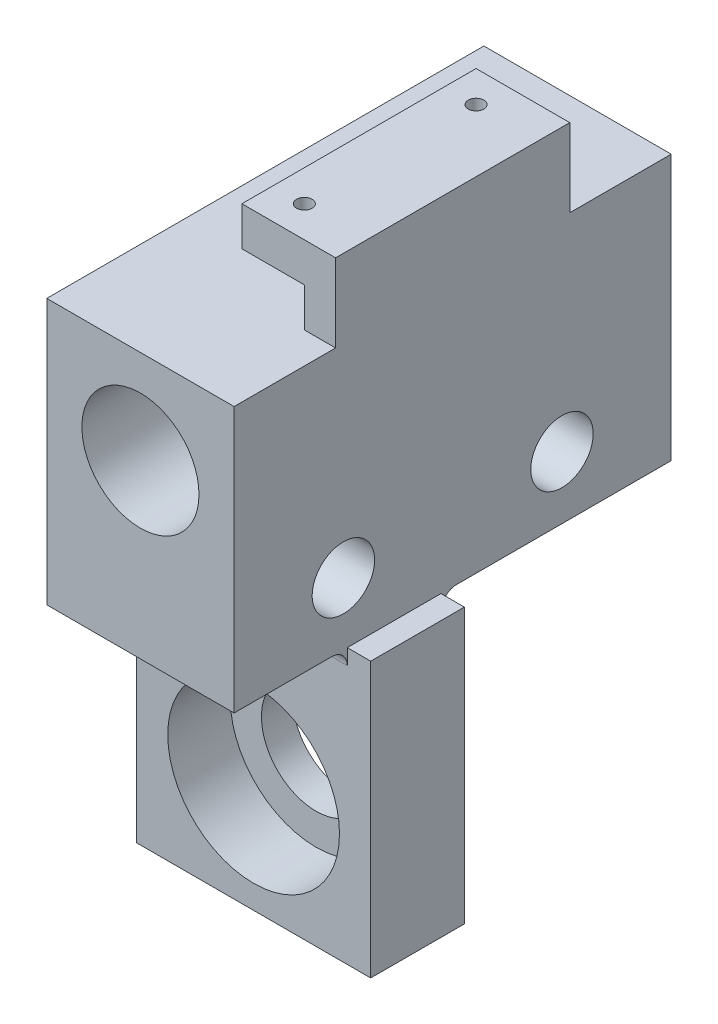
ISO-10303-21;
HEADER;
FILE_DESCRIPTION(('STEP AP214'),'2;1');
FILE_NAME('part.step','',(''),(''),'','','');
FILE_SCHEMA(('AUTOMOTIVE_DESIGN { 1 0 10303 214 1 1 1 1 }'));
ENDSEC;
DATA;
#1=APPLICATION_CONTEXT('core data for automotive mechanical design processes');
#2=APPLICATION_PROTOCOL_DEFINITION('international standard','automotive_design',2000,#1);
#3=PRODUCT_CONTEXT('',#1,'mechanical');
#4=PRODUCT('Part','Part','',(#3));
#5=PRODUCT_RELATED_PRODUCT_CATEGORY('part','',(#4));
#6=PRODUCT_DEFINITION_FORMATION('','',#4);
#7=PRODUCT_DEFINITION_CONTEXT('part definition',#1,'design');
#8=PRODUCT_DEFINITION('design','',#6,#7);
#9=PRODUCT_DEFINITION_SHAPE('','',#8);
#10=(LENGTH_UNIT() NAMED_UNIT(*) SI_UNIT(.MILLI.,.METRE.));
#11=(NAMED_UNIT(*) PLANE_ANGLE_UNIT() SI_UNIT($,.RADIAN.));
#12=(NAMED_UNIT(*) SI_UNIT($,.STERADIAN.) SOLID_ANGLE_UNIT());
#13=UNCERTAINTY_MEASURE_WITH_UNIT(LENGTH_MEASURE(1.E-05),#10,'distance_accuracy_value','');
#14=(GEOMETRIC_REPRESENTATION_CONTEXT(3) GLOBAL_UNCERTAINTY_ASSIGNED_CONTEXT((#13)) GLOBAL_UNIT_ASSIGNED_CONTEXT((#10,
#11,#12)) REPRESENTATION_CONTEXT('',''));
#15=CARTESIAN_POINT('',(0.,0.,0.));
#16=DIRECTION('',(0.,0.,1.));
#17=DIRECTION('',(1.,0.,0.));
#18=AXIS2_PLACEMENT_3D('',#15,#16,#17);
#19=CARTESIAN_POINT('',(-12.,12.,28.));
#20=DIRECTION('',(0.,-1.,0.));
#21=DIRECTION('',(0.,0.,-1.));
#22=AXIS2_PLACEMENT_3D('',#19,#20,#21);
#23=PLANE('',#22);
#24=DIRECTION('',(-1.,0.,0.));
#25=VECTOR('',#24,1.);
#26=CARTESIAN_POINT('',(-12.,12.,-28.));
#27=LINE('',#26,#25);
#28=CARTESIAN_POINT('',(12.,12.,-28.));
#29=VERTEX_POINT('',#28);
#30=CARTESIAN_POINT('',(-12.,12.,-28.));
#31=VERTEX_POINT('',#30);
#32=EDGE_CURVE('E259',#29,#31,#27,.T.);
#33=ORIENTED_EDGE('',*,*,#32,.T.);
#34=DIRECTION('',(0.,0.,-1.));
#35=VECTOR('',#34,1.);
#36=CARTESIAN_POINT('',(-12.,12.,28.));
#37=LINE('',#36,#35);
#38=CARTESIAN_POINT('',(-12.,12.,28.));
#39=VERTEX_POINT('',#38);
#40=EDGE_CURVE('E265',#39,#31,#37,.T.);
#41=ORIENTED_EDGE('',*,*,#40,.F.);
#42=DIRECTION('',(-1.,0.,0.));
#43=VECTOR('',#42,1.);
#44=CARTESIAN_POINT('',(-12.,12.,28.));
#45=LINE('',#44,#43);
#46=CARTESIAN_POINT('',(12.,12.,28.));
#47=VERTEX_POINT('',#46);
#48=EDGE_CURVE('E263',#47,#39,#45,.T.);
#49=ORIENTED_EDGE('',*,*,#48,.F.);
#50=DIRECTION('',(0.,0.,-1.));
#51=VECTOR('',#50,1.);
#52=CARTESIAN_POINT('',(12.,12.,28.));
#53=LINE('',#52,#51);
#54=CARTESIAN_POINT('',(12.,12.,15.));
#55=VERTEX_POINT('',#54);
#56=EDGE_CURVE('E186',#47,#55,#53,.T.);
#57=ORIENTED_EDGE('',*,*,#56,.T.);
#58=DIRECTION('',(1.,0.,0.));
#59=VECTOR('',#58,1.);
#60=CARTESIAN_POINT('',(0.,12.,15.));
#61=LINE('',#60,#59);
#62=CARTESIAN_POINT('',(8.,12.,15.));
#63=VERTEX_POINT('',#62);
#64=EDGE_CURVE('E180',#63,#55,#61,.T.);
#65=ORIENTED_EDGE('',*,*,#64,.F.);
#66=DIRECTION('',(0.,0.,1.));
#67=VECTOR('',#66,1.);
#68=CARTESIAN_POINT('',(8.,12.,-28.));
#69=LINE('',#68,#67);
#70=CARTESIAN_POINT('',(8.,12.,-15.));
#71=VERTEX_POINT('',#70);
#72=EDGE_CURVE('E47',#71,#63,#69,.T.);
#73=ORIENTED_EDGE('',*,*,#72,.F.);
#74=DIRECTION('',(-1.,0.,0.));
#75=VECTOR('',#74,1.);
#76=CARTESIAN_POINT('',(0.,12.,-15.));
#77=LINE('',#76,#75);
#78=CARTESIAN_POINT('',(12.,12.,-15.));
#79=VERTEX_POINT('',#78);
#80=EDGE_CURVE('E52',#79,#71,#77,.T.);
#81=ORIENTED_EDGE('',*,*,#80,.F.);
#82=EDGE_CURVE('E277',#79,#29,#53,.T.);
#83=ORIENTED_EDGE('',*,*,#82,.T.);
#84=EDGE_LOOP('',(#33,#41,#49,#57,#65,#73,#81,#83));
#85=FACE_BOUND('',#84,.T.);
#86=ADVANCED_FACE('F32',(#85),#23,.F.);
#87=CARTESIAN_POINT('',(-12.,-22.,28.));
#88=DIRECTION('',(0.,1.,0.));
#89=DIRECTION('',(0.,0.,1.));
#90=AXIS2_PLACEMENT_3D('',#87,#88,#89);
#91=PLANE('',#90);
#92=DIRECTION('',(0.,0.,-1.));
#93=VECTOR('',#92,1.);
#94=CARTESIAN_POINT('',(-12.,-22.,28.));
#95=LINE('',#94,#93);
#96=CARTESIAN_POINT('',(-12.,-22.,28.));
#97=VERTEX_POINT('',#96);
#98=CARTESIAN_POINT('',(-12.,-22.,15.5));
#99=VERTEX_POINT('',#98);
#100=EDGE_CURVE('E285',#97,#99,#95,.T.);
#101=ORIENTED_EDGE('',*,*,#100,.T.);
#102=DIRECTION('',(-1.,0.,0.));
#103=VECTOR('',#102,1.);
#104=CARTESIAN_POINT('',(12.,-22.,15.5));
#105=LINE('',#104,#103);
#106=CARTESIAN_POINT('',(12.,-22.,15.5));
#107=VERTEX_POINT('',#106);
#108=EDGE_CURVE('E307',#99,#107,#105,.F.);
#109=ORIENTED_EDGE('',*,*,#108,.T.);
#110=DIRECTION('',(0.,0.,-1.));
#111=VECTOR('',#110,1.);
#112=CARTESIAN_POINT('',(12.,-22.,28.));
#113=LINE('',#112,#111);
#114=CARTESIAN_POINT('',(12.,-22.,28.));
#115=VERTEX_POINT('',#114);
#116=EDGE_CURVE('E280',#115,#107,#113,.T.);
#117=ORIENTED_EDGE('',*,*,#116,.F.);
#118=DIRECTION('',(1.,0.,0.));
#119=VECTOR('',#118,1.);
#120=CARTESIAN_POINT('',(-12.,-22.,28.));
#121=LINE('',#120,#119);
#122=EDGE_CURVE('E258',#97,#115,#121,.T.);
#123=ORIENTED_EDGE('',*,*,#122,.F.);
#124=EDGE_LOOP('',(#101,#109,#117,#123));
#125=FACE_BOUND('',#124,.T.);
#126=ADVANCED_FACE('F367',(#125),#91,.F.);
#127=CARTESIAN_POINT('',(12.,-22.,-0.5));
#128=VERTEX_POINT('',#127);
#129=CARTESIAN_POINT('',(12.,-22.,-28.));
#130=VERTEX_POINT('',#129);
#131=EDGE_CURVE('E279',#128,#130,#113,.T.);
#132=ORIENTED_EDGE('',*,*,#131,.F.);
#133=DIRECTION('',(1.,0.,0.));
#134=VECTOR('',#133,1.);
#135=CARTESIAN_POINT('',(-12.,-22.,-0.5));
#136=LINE('',#135,#134);
#137=CARTESIAN_POINT('',(-12.,-22.,-0.5));
#138=VERTEX_POINT('',#137);
#139=EDGE_CURVE('E297',#128,#138,#136,.F.);
#140=ORIENTED_EDGE('',*,*,#139,.T.);
#141=CARTESIAN_POINT('',(-12.,-22.,-28.));
#142=VERTEX_POINT('',#141);
#143=EDGE_CURVE('E283',#138,#142,#95,.T.);
#144=ORIENTED_EDGE('',*,*,#143,.T.);
#145=DIRECTION('',(1.,0.,0.));
#146=VECTOR('',#145,1.);
#147=CARTESIAN_POINT('',(-12.,-22.,-28.));
#148=LINE('',#147,#146);
#149=EDGE_CURVE('E268',#142,#130,#148,.T.);
#150=ORIENTED_EDGE('',*,*,#149,.T.);
#151=EDGE_LOOP('',(#132,#140,#144,#150));
#152=FACE_BOUND('',#151,.T.);
#153=ADVANCED_FACE('F340',(#152),#91,.F.);
#154=CARTESIAN_POINT('',(0.,0.,28.));
#155=DIRECTION('',(0.,0.,1.));
#156=DIRECTION('',(1.,0.,0.));
#157=AXIS2_PLACEMENT_3D('',#154,#155,#156);
#158=PLANE('',#157);
#159=DIRECTION('',(0.,-1.,0.));
#160=VECTOR('',#159,1.);
#161=CARTESIAN_POINT('',(-12.,12.,28.));
#162=LINE('',#161,#160);
#163=EDGE_CURVE('E255',#39,#97,#162,.T.);
#164=ORIENTED_EDGE('',*,*,#163,.T.);
#165=ORIENTED_EDGE('',*,*,#122,.T.);
#166=DIRECTION('',(0.,1.,0.));
#167=VECTOR('',#166,1.);
#168=CARTESIAN_POINT('',(12.,12.,28.));
#169=LINE('',#168,#167);
#170=EDGE_CURVE('E261',#115,#47,#169,.T.);
#171=ORIENTED_EDGE('',*,*,#170,.T.);
#172=ORIENTED_EDGE('',*,*,#48,.T.);
#173=EDGE_LOOP('',(#164,#165,#171,#172));
#174=FACE_BOUND('',#173,.T.);
#175=CARTESIAN_POINT('',(0.,0.,28.));
#176=DIRECTION('',(0.,0.,1.));
#177=DIRECTION('',(1.,0.,0.));
#178=AXIS2_PLACEMENT_3D('',#175,#176,#177);
#179=CIRCLE('',#178,7.5);
#180=CARTESIAN_POINT('',(7.5,0.,28.));
#181=VERTEX_POINT('',#180);
#182=EDGE_CURVE('E249',#181,#181,#179,.T.);
#183=ORIENTED_EDGE('',*,*,#182,.F.);
#184=EDGE_LOOP('',(#183));
#185=FACE_BOUND('',#184,.T.);
#186=ADVANCED_FACE('F371',(#174,#185),#158,.T.);
#187=CARTESIAN_POINT('',(0.,0.,-28.));
#188=DIRECTION('',(0.,0.,1.));
#189=DIRECTION('',(1.,0.,0.));
#190=AXIS2_PLACEMENT_3D('',#187,#188,#189);
#191=PLANE('',#190);
#192=DIRECTION('',(0.,-1.,0.));
#193=VECTOR('',#192,1.);
#194=CARTESIAN_POINT('',(-12.,12.,-28.));
#195=LINE('',#194,#193);
#196=EDGE_CURVE('E252',#31,#142,#195,.T.);
#197=ORIENTED_EDGE('',*,*,#196,.F.);
#198=ORIENTED_EDGE('',*,*,#32,.F.);
#199=DIRECTION('',(0.,1.,0.));
#200=VECTOR('',#199,1.);
#201=CARTESIAN_POINT('',(12.,12.,-28.));
#202=LINE('',#201,#200);
#203=EDGE_CURVE('E271',#130,#29,#202,.T.);
#204=ORIENTED_EDGE('',*,*,#203,.F.);
#205=ORIENTED_EDGE('',*,*,#149,.F.);
#206=EDGE_LOOP('',(#197,#198,#204,#205));
#207=FACE_BOUND('',#206,.T.);
#208=CARTESIAN_POINT('',(0.,0.,-28.));
#209=DIRECTION('',(0.,0.,1.));
#210=DIRECTION('',(1.,0.,0.));
#211=AXIS2_PLACEMENT_3D('',#208,#209,#210);
#212=CIRCLE('',#211,7.5);
#213=CARTESIAN_POINT('',(7.5,0.,-28.));
#214=VERTEX_POINT('',#213);
#215=EDGE_CURVE('E248',#214,#214,#212,.T.);
#216=ORIENTED_EDGE('',*,*,#215,.T.);
#217=EDGE_LOOP('',(#216));
#218=FACE_BOUND('',#217,.T.);
#219=ADVANCED_FACE('F336',(#207,#218),#191,.F.);
#220=CARTESIAN_POINT('',(-12.,12.,28.));
#221=DIRECTION('',(1.,0.,0.));
#222=DIRECTION('',(0.,1.,0.));
#223=AXIS2_PLACEMENT_3D('',#220,#221,#222);
#224=PLANE('',#223);
#225=ORIENTED_EDGE('',*,*,#196,.T.);
#226=ORIENTED_EDGE('',*,*,#143,.F.);
#227=CARTESIAN_POINT('',(-12.,-24.,-0.5));
#228=DIRECTION('',(1.,0.,0.));
#229=DIRECTION('',(0.,1.,0.));
#230=AXIS2_PLACEMENT_3D('',#227,#228,#229);
#231=CIRCLE('',#230,2.);
#232=CARTESIAN_POINT('',(-12.,-24.,1.5));
#233=VERTEX_POINT('',#232);
#234=EDGE_CURVE('E311',#138,#233,#231,.T.);
#235=ORIENTED_EDGE('',*,*,#234,.T.);
#236=DIRECTION('',(0.,-1.,0.));
#237=VECTOR('',#236,1.);
#238=CARTESIAN_POINT('',(-12.,12.,1.5));
#239=LINE('',#238,#237);
#240=CARTESIAN_POINT('',(-12.,-22.,1.5));
#241=VERTEX_POINT('',#240);
#242=EDGE_CURVE('E288',#241,#233,#239,.T.);
#243=ORIENTED_EDGE('',*,*,#242,.F.);
#244=CARTESIAN_POINT('',(-12.,-22.,13.5));
#245=VERTEX_POINT('',#244);
#246=EDGE_CURVE('E289',#245,#241,#95,.T.);
#247=ORIENTED_EDGE('',*,*,#246,.F.);
#248=DIRECTION('',(0.,1.,0.));
#249=VECTOR('',#248,1.);
#250=CARTESIAN_POINT('',(-12.,12.,13.5));
#251=LINE('',#250,#249);
#252=CARTESIAN_POINT('',(-12.,-24.,13.5));
#253=VERTEX_POINT('',#252);
#254=EDGE_CURVE('E305',#253,#245,#251,.T.);
#255=ORIENTED_EDGE('',*,*,#254,.F.);
#256=CARTESIAN_POINT('',(-12.,-24.,15.5));
#257=DIRECTION('',(1.,0.,0.));
#258=DIRECTION('',(0.,1.,0.));
#259=AXIS2_PLACEMENT_3D('',#256,#257,#258);
#260=CIRCLE('',#259,2.);
#261=EDGE_CURVE('E313',#253,#99,#260,.T.);
#262=ORIENTED_EDGE('',*,*,#261,.T.);
#263=ORIENTED_EDGE('',*,*,#100,.F.);
#264=ORIENTED_EDGE('',*,*,#163,.F.);
#265=ORIENTED_EDGE('',*,*,#40,.T.);
#266=EDGE_LOOP('',(#225,#226,#235,#243,#247,#255,#262,#263,#264,#265));
#267=FACE_BOUND('',#266,.T.);
#268=ADVANCED_FACE('F332',(#267),#224,.F.);
#269=CARTESIAN_POINT('',(12.,12.,28.));
#270=DIRECTION('',(-1.,0.,0.));
#271=DIRECTION('',(0.,-1.,0.));
#272=AXIS2_PLACEMENT_3D('',#269,#270,#271);
#273=PLANE('',#272);
#274=CARTESIAN_POINT('',(12.,-14.,-14.));
#275=DIRECTION('',(1.,0.,0.));
#276=DIRECTION('',(0.,1.,0.));
#277=AXIS2_PLACEMENT_3D('',#274,#275,#276);
#278=CIRCLE('',#277,4.);
#279=CARTESIAN_POINT('',(12.,-10.,-14.));
#280=VERTEX_POINT('',#279);
#281=EDGE_CURVE('E406',#280,#280,#278,.T.);
#282=ORIENTED_EDGE('',*,*,#281,.F.);
#283=EDGE_LOOP('',(#282));
#284=FACE_BOUND('',#283,.T.);
#285=CARTESIAN_POINT('',(12.,-14.,14.));
#286=DIRECTION('',(1.,0.,0.));
#287=DIRECTION('',(0.,1.,0.));
#288=AXIS2_PLACEMENT_3D('',#285,#286,#287);
#289=CIRCLE('',#288,4.);
#290=CARTESIAN_POINT('',(12.,-10.,14.));
#291=VERTEX_POINT('',#290);
#292=EDGE_CURVE('E400',#291,#291,#289,.T.);
#293=ORIENTED_EDGE('',*,*,#292,.F.);
#294=EDGE_LOOP('',(#293));
#295=FACE_BOUND('',#294,.T.);
#296=ORIENTED_EDGE('',*,*,#203,.T.);
#297=ORIENTED_EDGE('',*,*,#82,.F.);
#298=DIRECTION('',(0.,-1.,0.));
#299=VECTOR('',#298,1.);
#300=CARTESIAN_POINT('',(12.,22.,-15.));
#301=LINE('',#300,#299);
#302=CARTESIAN_POINT('',(12.,22.,-15.));
#303=VERTEX_POINT('',#302);
#304=EDGE_CURVE('E201',#303,#79,#301,.T.);
#305=ORIENTED_EDGE('',*,*,#304,.F.);
#306=DIRECTION('',(0.,0.,-1.));
#307=VECTOR('',#306,1.);
#308=CARTESIAN_POINT('',(12.,22.,-15.));
#309=LINE('',#308,#307);
#310=CARTESIAN_POINT('',(12.,22.,15.));
#311=VERTEX_POINT('',#310);
#312=EDGE_CURVE('E324',#311,#303,#309,.T.);
#313=ORIENTED_EDGE('',*,*,#312,.F.);
#314=DIRECTION('',(0.,-1.,0.));
#315=VECTOR('',#314,1.);
#316=CARTESIAN_POINT('',(12.,22.,15.));
#317=LINE('',#316,#315);
#318=EDGE_CURVE('E204',#311,#55,#317,.T.);
#319=ORIENTED_EDGE('',*,*,#318,.T.);
#320=ORIENTED_EDGE('',*,*,#56,.F.);
#321=ORIENTED_EDGE('',*,*,#170,.F.);
#322=ORIENTED_EDGE('',*,*,#116,.T.);
#323=CARTESIAN_POINT('',(12.,-24.,15.5));
#324=DIRECTION('',(-1.,0.,0.));
#325=DIRECTION('',(0.,-1.,0.));
#326=AXIS2_PLACEMENT_3D('',#323,#324,#325);
#327=CIRCLE('',#326,2.);
#328=CARTESIAN_POINT('',(12.,-24.,13.5));
#329=VERTEX_POINT('',#328);
#330=EDGE_CURVE('E315',#107,#329,#327,.T.);
#331=ORIENTED_EDGE('',*,*,#330,.T.);
#332=DIRECTION('',(0.,-1.,0.));
#333=VECTOR('',#332,1.);
#334=CARTESIAN_POINT('',(12.,12.,13.5));
#335=LINE('',#334,#333);
#336=CARTESIAN_POINT('',(12.,-22.,13.5));
#337=VERTEX_POINT('',#336);
#338=EDGE_CURVE('E299',#337,#329,#335,.T.);
#339=ORIENTED_EDGE('',*,*,#338,.F.);
#340=CARTESIAN_POINT('',(12.,-22.,1.5));
#341=VERTEX_POINT('',#340);
#342=EDGE_CURVE('E284',#337,#341,#113,.T.);
#343=ORIENTED_EDGE('',*,*,#342,.T.);
#344=DIRECTION('',(0.,1.,0.));
#345=VECTOR('',#344,1.);
#346=CARTESIAN_POINT('',(12.,12.,1.5));
#347=LINE('',#346,#345);
#348=CARTESIAN_POINT('',(12.,-24.,1.5));
#349=VERTEX_POINT('',#348);
#350=EDGE_CURVE('E295',#349,#341,#347,.T.);
#351=ORIENTED_EDGE('',*,*,#350,.F.);
#352=CARTESIAN_POINT('',(12.,-24.,-0.5));
#353=DIRECTION('',(-1.,0.,0.));
#354=DIRECTION('',(0.,-1.,0.));
#355=AXIS2_PLACEMENT_3D('',#352,#353,#354);
#356=CIRCLE('',#355,2.);
#357=EDGE_CURVE('E309',#349,#128,#356,.T.);
#358=ORIENTED_EDGE('',*,*,#357,.T.);
#359=ORIENTED_EDGE('',*,*,#131,.T.);
#360=EDGE_LOOP('',(#296,#297,#305,#313,#319,#320,#321,#322,#331,#339,#343,#351,#358,#359));
#361=FACE_BOUND('',#360,.T.);
#362=ADVANCED_FACE('F323',(#284,#295,#361),#273,.F.);
#363=CARTESIAN_POINT('',(0.,0.,28.));
#364=DIRECTION('',(0.,0.,-1.));
#365=DIRECTION('',(-1.,0.,0.));
#366=AXIS2_PLACEMENT_3D('',#363,#364,#365);
#367=CYLINDRICAL_SURFACE('',#366,7.5);
#368=ORIENTED_EDGE('',*,*,#182,.T.);
#369=EDGE_LOOP('',(#368));
#370=FACE_BOUND('',#369,.T.);
#371=ORIENTED_EDGE('',*,*,#215,.F.);
#372=EDGE_LOOP('',(#371));
#373=FACE_BOUND('',#372,.T.);
#374=ADVANCED_FACE('F458',(#370,#373),#367,.F.);
#375=CARTESIAN_POINT('',(0.,-22.,0.));
#376=DIRECTION('',(0.,-1.,0.));
#377=DIRECTION('',(0.,0.,-1.));
#378=AXIS2_PLACEMENT_3D('',#375,#376,#377);
#379=PLANE('',#378);
#380=DIRECTION('',(-1.,0.,0.));
#381=VECTOR('',#380,1.);
#382=CARTESIAN_POINT('',(-15.,-22.,13.5));
#383=LINE('',#382,#381);
#384=CARTESIAN_POINT('',(-15.,-22.,13.5));
#385=VERTEX_POINT('',#384);
#386=EDGE_CURVE('E234',#245,#385,#383,.T.);
#387=ORIENTED_EDGE('',*,*,#386,.F.);
#388=ORIENTED_EDGE('',*,*,#246,.T.);
#389=DIRECTION('',(1.,0.,0.));
#390=VECTOR('',#389,1.);
#391=CARTESIAN_POINT('',(-15.,-22.,1.5));
#392=LINE('',#391,#390);
#393=CARTESIAN_POINT('',(-15.,-22.,1.5));
#394=VERTEX_POINT('',#393);
#395=EDGE_CURVE('E229',#394,#241,#392,.T.);
#396=ORIENTED_EDGE('',*,*,#395,.F.);
#397=DIRECTION('',(0.,0.,-1.));
#398=VECTOR('',#397,1.);
#399=CARTESIAN_POINT('',(-15.,-22.,13.5));
#400=LINE('',#399,#398);
#401=EDGE_CURVE('E212',#385,#394,#400,.T.);
#402=ORIENTED_EDGE('',*,*,#401,.F.);
#403=EDGE_LOOP('',(#387,#388,#396,#402));
#404=FACE_BOUND('',#403,.T.);
#405=ADVANCED_FACE('F347',(#404),#379,.F.);
#406=CARTESIAN_POINT('',(-15.,-57.15,13.5));
#407=DIRECTION('',(1.,0.,0.));
#408=DIRECTION('',(0.,0.,-1.));
#409=AXIS2_PLACEMENT_3D('',#406,#407,#408);
#410=PLANE('',#409);
#411=ORIENTED_EDGE('',*,*,#401,.T.);
#412=DIRECTION('',(0.,1.,0.));
#413=VECTOR('',#412,1.);
#414=CARTESIAN_POINT('',(-15.,-57.15,1.5));
#415=LINE('',#414,#413);
#416=CARTESIAN_POINT('',(-15.,-57.15,1.5));
#417=VERTEX_POINT('',#416);
#418=EDGE_CURVE('E245',#417,#394,#415,.T.);
#419=ORIENTED_EDGE('',*,*,#418,.F.);
#420=DIRECTION('',(0.,0.,-1.));
#421=VECTOR('',#420,1.);
#422=CARTESIAN_POINT('',(-15.,-57.15,13.5));
#423=LINE('',#422,#421);
#424=CARTESIAN_POINT('',(-15.,-57.15,13.5));
#425=VERTEX_POINT('',#424);
#426=EDGE_CURVE('E215',#425,#417,#423,.T.);
#427=ORIENTED_EDGE('',*,*,#426,.F.);
#428=DIRECTION('',(0.,1.,0.));
#429=VECTOR('',#428,1.);
#430=CARTESIAN_POINT('',(-15.,-57.15,13.5));
#431=LINE('',#430,#429);
#432=EDGE_CURVE('E225',#425,#385,#431,.T.);
#433=ORIENTED_EDGE('',*,*,#432,.T.);
#434=EDGE_LOOP('',(#411,#419,#427,#433));
#435=FACE_BOUND('',#434,.T.);
#436=ADVANCED_FACE('F357',(#435),#410,.F.);
#437=CARTESIAN_POINT('',(-15.,-57.15,1.5));
#438=DIRECTION('',(0.,0.,1.));
#439=DIRECTION('',(1.,0.,0.));
#440=AXIS2_PLACEMENT_3D('',#437,#438,#439);
#441=PLANE('',#440);
#442=CARTESIAN_POINT('',(0.,-43.15,1.5));
#443=DIRECTION('',(0.,0.,1.));
#444=DIRECTION('',(1.,0.,0.));
#445=AXIS2_PLACEMENT_3D('',#442,#443,#444);
#446=CIRCLE('',#445,7.);
#447=CARTESIAN_POINT('',(7.,-43.15,1.5));
#448=VERTEX_POINT('',#447);
#449=EDGE_CURVE('E409',#448,#448,#446,.T.);
#450=ORIENTED_EDGE('',*,*,#449,.T.);
#451=EDGE_LOOP('',(#450));
#452=FACE_BOUND('',#451,.T.);
#453=DIRECTION('',(1.,0.,0.));
#454=VECTOR('',#453,1.);
#455=CARTESIAN_POINT('',(12.,-24.,1.5));
#456=LINE('',#455,#454);
#457=EDGE_CURVE('E292',#233,#349,#456,.T.);
#458=ORIENTED_EDGE('',*,*,#457,.T.);
#459=ORIENTED_EDGE('',*,*,#350,.T.);
#460=CARTESIAN_POINT('',(15.,-22.,1.5));
#461=VERTEX_POINT('',#460);
#462=EDGE_CURVE('E228',#341,#461,#392,.T.);
#463=ORIENTED_EDGE('',*,*,#462,.T.);
#464=DIRECTION('',(0.,1.,0.));
#465=VECTOR('',#464,1.);
#466=CARTESIAN_POINT('',(15.,-57.15,1.5));
#467=LINE('',#466,#465);
#468=CARTESIAN_POINT('',(15.,-57.15,1.5));
#469=VERTEX_POINT('',#468);
#470=EDGE_CURVE('E242',#469,#461,#467,.T.);
#471=ORIENTED_EDGE('',*,*,#470,.F.);
#472=DIRECTION('',(1.,0.,0.));
#473=VECTOR('',#472,1.);
#474=CARTESIAN_POINT('',(-15.,-57.15,1.5));
#475=LINE('',#474,#473);
#476=EDGE_CURVE('E218',#417,#469,#475,.T.);
#477=ORIENTED_EDGE('',*,*,#476,.F.);
#478=ORIENTED_EDGE('',*,*,#418,.T.);
#479=ORIENTED_EDGE('',*,*,#395,.T.);
#480=ORIENTED_EDGE('',*,*,#242,.T.);
#481=EDGE_LOOP('',(#458,#459,#463,#471,#477,#478,#479,#480));
#482=FACE_BOUND('',#481,.T.);
#483=ADVANCED_FACE('F352',(#452,#482),#441,.F.);
#484=CARTESIAN_POINT('',(15.,-57.15,13.5));
#485=DIRECTION('',(-1.,0.,0.));
#486=DIRECTION('',(0.,0.,1.));
#487=AXIS2_PLACEMENT_3D('',#484,#485,#486);
#488=PLANE('',#487);
#489=DIRECTION('',(0.,0.,1.));
#490=VECTOR('',#489,1.);
#491=CARTESIAN_POINT('',(15.,-22.,13.5));
#492=LINE('',#491,#490);
#493=CARTESIAN_POINT('',(15.,-22.,13.5));
#494=VERTEX_POINT('',#493);
#495=EDGE_CURVE('E232',#461,#494,#492,.T.);
#496=ORIENTED_EDGE('',*,*,#495,.T.);
#497=DIRECTION('',(0.,1.,0.));
#498=VECTOR('',#497,1.);
#499=CARTESIAN_POINT('',(15.,-57.15,13.5));
#500=LINE('',#499,#498);
#501=CARTESIAN_POINT('',(15.,-57.15,13.5));
#502=VERTEX_POINT('',#501);
#503=EDGE_CURVE('E239',#502,#494,#500,.T.);
#504=ORIENTED_EDGE('',*,*,#503,.F.);
#505=DIRECTION('',(0.,0.,1.));
#506=VECTOR('',#505,1.);
#507=CARTESIAN_POINT('',(15.,-57.15,13.5));
#508=LINE('',#507,#506);
#509=EDGE_CURVE('E221',#469,#502,#508,.T.);
#510=ORIENTED_EDGE('',*,*,#509,.F.);
#511=ORIENTED_EDGE('',*,*,#470,.T.);
#512=EDGE_LOOP('',(#496,#504,#510,#511));
#513=FACE_BOUND('',#512,.T.);
#514=ADVANCED_FACE('F437',(#513),#488,.F.);
#515=CARTESIAN_POINT('',(-15.,-57.15,13.5));
#516=DIRECTION('',(0.,0.,-1.));
#517=DIRECTION('',(-1.,0.,0.));
#518=AXIS2_PLACEMENT_3D('',#515,#516,#517);
#519=PLANE('',#518);
#520=CARTESIAN_POINT('',(0.,-43.15,13.5));
#521=DIRECTION('',(0.,0.,1.));
#522=DIRECTION('',(1.,0.,0.));
#523=AXIS2_PLACEMENT_3D('',#520,#521,#522);
#524=CIRCLE('',#523,11.);
#525=CARTESIAN_POINT('',(11.,-43.15,13.5));
#526=VERTEX_POINT('',#525);
#527=EDGE_CURVE('E208',#526,#526,#524,.T.);
#528=ORIENTED_EDGE('',*,*,#527,.F.);
#529=EDGE_LOOP('',(#528));
#530=FACE_BOUND('',#529,.T.);
#531=DIRECTION('',(-1.,0.,0.));
#532=VECTOR('',#531,1.);
#533=CARTESIAN_POINT('',(-12.,-24.,13.5));
#534=LINE('',#533,#532);
#535=EDGE_CURVE('E302',#329,#253,#534,.T.);
#536=ORIENTED_EDGE('',*,*,#535,.T.);
#537=ORIENTED_EDGE('',*,*,#254,.T.);
#538=ORIENTED_EDGE('',*,*,#386,.T.);
#539=ORIENTED_EDGE('',*,*,#432,.F.);
#540=DIRECTION('',(-1.,0.,0.));
#541=VECTOR('',#540,1.);
#542=CARTESIAN_POINT('',(-15.,-57.15,13.5));
#543=LINE('',#542,#541);
#544=EDGE_CURVE('E223',#502,#425,#543,.T.);
#545=ORIENTED_EDGE('',*,*,#544,.F.);
#546=ORIENTED_EDGE('',*,*,#503,.T.);
#547=EDGE_CURVE('E219',#494,#337,#383,.T.);
#548=ORIENTED_EDGE('',*,*,#547,.T.);
#549=ORIENTED_EDGE('',*,*,#338,.T.);
#550=EDGE_LOOP('',(#536,#537,#538,#539,#545,#546,#548,#549));
#551=FACE_BOUND('',#550,.T.);
#552=ADVANCED_FACE('F361',(#530,#551),#519,.F.);
#553=CARTESIAN_POINT('',(0.,-57.15,0.));
#554=DIRECTION('',(0.,-1.,0.));
#555=DIRECTION('',(0.,0.,-1.));
#556=AXIS2_PLACEMENT_3D('',#553,#554,#555);
#557=PLANE('',#556);
#558=ORIENTED_EDGE('',*,*,#426,.T.);
#559=ORIENTED_EDGE('',*,*,#476,.T.);
#560=ORIENTED_EDGE('',*,*,#509,.T.);
#561=ORIENTED_EDGE('',*,*,#544,.T.);
#562=EDGE_LOOP('',(#558,#559,#560,#561));
#563=FACE_BOUND('',#562,.T.);
#564=ADVANCED_FACE('F436',(#563),#557,.T.);
#565=ORIENTED_EDGE('',*,*,#342,.F.);
#566=ORIENTED_EDGE('',*,*,#547,.F.);
#567=ORIENTED_EDGE('',*,*,#495,.F.);
#568=ORIENTED_EDGE('',*,*,#462,.F.);
#569=EDGE_LOOP('',(#565,#566,#567,#568));
#570=FACE_BOUND('',#569,.T.);
#571=ADVANCED_FACE('F431',(#570),#379,.F.);
#572=CARTESIAN_POINT('',(0.,-43.15,5.5));
#573=DIRECTION('',(0.,0.,1.));
#574=DIRECTION('',(1.,0.,0.));
#575=AXIS2_PLACEMENT_3D('',#572,#573,#574);
#576=CYLINDRICAL_SURFACE('',#575,11.);
#577=CARTESIAN_POINT('',(0.,-43.15,5.5));
#578=DIRECTION('',(0.,0.,1.));
#579=DIRECTION('',(1.,0.,0.));
#580=AXIS2_PLACEMENT_3D('',#577,#578,#579);
#581=CIRCLE('',#580,11.);
#582=CARTESIAN_POINT('',(11.,-43.15,5.5));
#583=VERTEX_POINT('',#582);
#584=EDGE_CURVE('E209',#583,#583,#581,.T.);
#585=ORIENTED_EDGE('',*,*,#584,.F.);
#586=EDGE_LOOP('',(#585));
#587=FACE_BOUND('',#586,.T.);
#588=ORIENTED_EDGE('',*,*,#527,.T.);
#589=EDGE_LOOP('',(#588));
#590=FACE_BOUND('',#589,.T.);
#591=ADVANCED_FACE('F425',(#587,#590),#576,.F.);
#592=CARTESIAN_POINT('',(0.,-43.15,5.5));
#593=DIRECTION('',(0.,0.,1.));
#594=DIRECTION('',(1.,0.,0.));
#595=AXIS2_PLACEMENT_3D('',#592,#593,#594);
#596=PLANE('',#595);
#597=CARTESIAN_POINT('',(0.,-43.15,5.5));
#598=DIRECTION('',(0.,0.,1.));
#599=DIRECTION('',(1.,0.,0.));
#600=AXIS2_PLACEMENT_3D('',#597,#598,#599);
#601=CIRCLE('',#600,7.);
#602=CARTESIAN_POINT('',(7.,-43.15,5.5));
#603=VERTEX_POINT('',#602);
#604=EDGE_CURVE('E414',#603,#603,#601,.T.);
#605=ORIENTED_EDGE('',*,*,#604,.F.);
#606=EDGE_LOOP('',(#605));
#607=FACE_BOUND('',#606,.T.);
#608=ORIENTED_EDGE('',*,*,#584,.T.);
#609=EDGE_LOOP('',(#608));
#610=FACE_BOUND('',#609,.T.);
#611=ADVANCED_FACE('F421',(#607,#610),#596,.T.);
#612=CARTESIAN_POINT('',(-15.,-24.,-0.5));
#613=DIRECTION('',(-1.,0.,0.));
#614=DIRECTION('',(0.,0.,1.));
#615=AXIS2_PLACEMENT_3D('',#612,#613,#614);
#616=CYLINDRICAL_SURFACE('',#615,2.);
#617=ORIENTED_EDGE('',*,*,#234,.F.);
#618=ORIENTED_EDGE('',*,*,#139,.F.);
#619=ORIENTED_EDGE('',*,*,#357,.F.);
#620=ORIENTED_EDGE('',*,*,#457,.F.);
#621=EDGE_LOOP('',(#617,#618,#619,#620));
#622=FACE_BOUND('',#621,.T.);
#623=ADVANCED_FACE('F424',(#622),#616,.F.);
#624=CARTESIAN_POINT('',(-15.,-24.,15.5));
#625=DIRECTION('',(1.,0.,0.));
#626=DIRECTION('',(0.,0.,-1.));
#627=AXIS2_PLACEMENT_3D('',#624,#625,#626);
#628=CYLINDRICAL_SURFACE('',#627,2.);
#629=ORIENTED_EDGE('',*,*,#330,.F.);
#630=ORIENTED_EDGE('',*,*,#108,.F.);
#631=ORIENTED_EDGE('',*,*,#261,.F.);
#632=ORIENTED_EDGE('',*,*,#535,.F.);
#633=EDGE_LOOP('',(#629,#630,#631,#632));
#634=FACE_BOUND('',#633,.T.);
#635=ADVANCED_FACE('F34',(#634),#628,.F.);
#636=CARTESIAN_POINT('',(0.,22.,-15.));
#637=DIRECTION('',(1.,0.,0.));
#638=DIRECTION('',(0.,0.,-1.));
#639=AXIS2_PLACEMENT_3D('',#636,#637,#638);
#640=PLANE('',#639);
#641=DIRECTION('',(0.,-1.,0.));
#642=VECTOR('',#641,1.);
#643=CARTESIAN_POINT('',(0.,22.,-15.));
#644=LINE('',#643,#642);
#645=CARTESIAN_POINT('',(0.,22.,-15.));
#646=VERTEX_POINT('',#645);
#647=CARTESIAN_POINT('',(0.,17.,-15.));
#648=VERTEX_POINT('',#647);
#649=EDGE_CURVE('E198',#646,#648,#644,.T.);
#650=ORIENTED_EDGE('',*,*,#649,.T.);
#651=DIRECTION('',(0.,0.,1.));
#652=VECTOR('',#651,1.);
#653=CARTESIAN_POINT('',(0.,17.,-28.));
#654=LINE('',#653,#652);
#655=CARTESIAN_POINT('',(0.,17.,15.));
#656=VERTEX_POINT('',#655);
#657=EDGE_CURVE('E188',#648,#656,#654,.T.);
#658=ORIENTED_EDGE('',*,*,#657,.T.);
#659=DIRECTION('',(0.,-1.,0.));
#660=VECTOR('',#659,1.);
#661=CARTESIAN_POINT('',(0.,22.,15.));
#662=LINE('',#661,#660);
#663=CARTESIAN_POINT('',(0.,22.,15.));
#664=VERTEX_POINT('',#663);
#665=EDGE_CURVE('E206',#664,#656,#662,.T.);
#666=ORIENTED_EDGE('',*,*,#665,.F.);
#667=DIRECTION('',(0.,0.,1.));
#668=VECTOR('',#667,1.);
#669=CARTESIAN_POINT('',(0.,22.,-15.));
#670=LINE('',#669,#668);
#671=EDGE_CURVE('E190',#646,#664,#670,.T.);
#672=ORIENTED_EDGE('',*,*,#671,.F.);
#673=EDGE_LOOP('',(#650,#658,#666,#672));
#674=FACE_BOUND('',#673,.T.);
#675=ADVANCED_FACE('F382',(#674),#640,.F.);
#676=CARTESIAN_POINT('',(0.,22.,15.));
#677=DIRECTION('',(0.,0.,-1.));
#678=DIRECTION('',(-1.,0.,0.));
#679=AXIS2_PLACEMENT_3D('',#676,#677,#678);
#680=PLANE('',#679);
#681=ORIENTED_EDGE('',*,*,#665,.T.);
#682=DIRECTION('',(-1.,0.,0.));
#683=VECTOR('',#682,1.);
#684=CARTESIAN_POINT('',(0.,17.,15.));
#685=LINE('',#684,#683);
#686=CARTESIAN_POINT('',(8.,17.,15.));
#687=VERTEX_POINT('',#686);
#688=EDGE_CURVE('E174',#687,#656,#685,.T.);
#689=ORIENTED_EDGE('',*,*,#688,.F.);
#690=DIRECTION('',(0.,1.,0.));
#691=VECTOR('',#690,1.);
#692=CARTESIAN_POINT('',(8.,17.,15.));
#693=LINE('',#692,#691);
#694=EDGE_CURVE('E170',#63,#687,#693,.T.);
#695=ORIENTED_EDGE('',*,*,#694,.F.);
#696=ORIENTED_EDGE('',*,*,#64,.T.);
#697=ORIENTED_EDGE('',*,*,#318,.F.);
#698=DIRECTION('',(1.,0.,0.));
#699=VECTOR('',#698,1.);
#700=CARTESIAN_POINT('',(0.,22.,15.));
#701=LINE('',#700,#699);
#702=EDGE_CURVE('E373',#664,#311,#701,.T.);
#703=ORIENTED_EDGE('',*,*,#702,.F.);
#704=EDGE_LOOP('',(#681,#689,#695,#696,#697,#703));
#705=FACE_BOUND('',#704,.T.);
#706=ADVANCED_FACE('F178',(#705),#680,.F.);
#707=CARTESIAN_POINT('',(0.,22.,-15.));
#708=DIRECTION('',(0.,0.,1.));
#709=DIRECTION('',(1.,0.,0.));
#710=AXIS2_PLACEMENT_3D('',#707,#708,#709);
#711=PLANE('',#710);
#712=DIRECTION('',(0.,1.,0.));
#713=VECTOR('',#712,1.);
#714=CARTESIAN_POINT('',(8.,22.,-15.));
#715=LINE('',#714,#713);
#716=CARTESIAN_POINT('',(8.,17.,-15.));
#717=VERTEX_POINT('',#716);
#718=EDGE_CURVE('E40',#71,#717,#715,.T.);
#719=ORIENTED_EDGE('',*,*,#718,.T.);
#720=DIRECTION('',(-1.,0.,0.));
#721=VECTOR('',#720,1.);
#722=CARTESIAN_POINT('',(0.,17.,-15.));
#723=LINE('',#722,#721);
#724=EDGE_CURVE('E11',#717,#648,#723,.T.);
#725=ORIENTED_EDGE('',*,*,#724,.T.);
#726=ORIENTED_EDGE('',*,*,#649,.F.);
#727=DIRECTION('',(-1.,0.,0.));
#728=VECTOR('',#727,1.);
#729=CARTESIAN_POINT('',(0.,22.,-15.));
#730=LINE('',#729,#728);
#731=EDGE_CURVE('E195',#303,#646,#730,.T.);
#732=ORIENTED_EDGE('',*,*,#731,.F.);
#733=ORIENTED_EDGE('',*,*,#304,.T.);
#734=ORIENTED_EDGE('',*,*,#80,.T.);
#735=EDGE_LOOP('',(#719,#725,#726,#732,#733,#734));
#736=FACE_BOUND('',#735,.T.);
#737=ADVANCED_FACE('F317',(#736),#711,.F.);
#738=CARTESIAN_POINT('',(0.,22.,0.));
#739=DIRECTION('',(0.,1.,0.));
#740=DIRECTION('',(0.,0.,1.));
#741=AXIS2_PLACEMENT_3D('',#738,#739,#740);
#742=PLANE('',#741);
#743=CARTESIAN_POINT('',(4.,22.,11.));
#744=DIRECTION('',(0.,1.,0.));
#745=DIRECTION('',(0.,0.,1.));
#746=AXIS2_PLACEMENT_3D('',#743,#744,#745);
#747=CIRCLE('',#746,1.);
#748=CARTESIAN_POINT('',(4.,22.,12.));
#749=VERTEX_POINT('',#748);
#750=EDGE_CURVE('E393',#749,#749,#747,.T.);
#751=ORIENTED_EDGE('',*,*,#750,.F.);
#752=EDGE_LOOP('',(#751));
#753=FACE_BOUND('',#752,.T.);
#754=CARTESIAN_POINT('',(4.,22.,-11.));
#755=DIRECTION('',(0.,1.,0.));
#756=DIRECTION('',(0.,0.,1.));
#757=AXIS2_PLACEMENT_3D('',#754,#755,#756);
#758=CIRCLE('',#757,1.);
#759=CARTESIAN_POINT('',(4.,22.,-10.));
#760=VERTEX_POINT('',#759);
#761=EDGE_CURVE('E182',#760,#760,#758,.T.);
#762=ORIENTED_EDGE('',*,*,#761,.F.);
#763=EDGE_LOOP('',(#762));
#764=FACE_BOUND('',#763,.T.);
#765=ORIENTED_EDGE('',*,*,#671,.T.);
#766=ORIENTED_EDGE('',*,*,#702,.T.);
#767=ORIENTED_EDGE('',*,*,#312,.T.);
#768=ORIENTED_EDGE('',*,*,#731,.T.);
#769=EDGE_LOOP('',(#765,#766,#767,#768));
#770=FACE_BOUND('',#769,.T.);
#771=ADVANCED_FACE('F379',(#753,#764,#770),#742,.T.);
#772=CARTESIAN_POINT('',(0.,17.,-28.));
#773=DIRECTION('',(0.,1.,0.));
#774=DIRECTION('',(0.,0.,1.));
#775=AXIS2_PLACEMENT_3D('',#772,#773,#774);
#776=PLANE('',#775);
#777=CARTESIAN_POINT('',(4.,17.,11.));
#778=DIRECTION('',(0.,1.,0.));
#779=DIRECTION('',(0.,0.,1.));
#780=AXIS2_PLACEMENT_3D('',#777,#778,#779);
#781=CIRCLE('',#780,1.);
#782=CARTESIAN_POINT('',(4.,17.,12.));
#783=VERTEX_POINT('',#782);
#784=EDGE_CURVE('E396',#783,#783,#781,.F.);
#785=ORIENTED_EDGE('',*,*,#784,.F.);
#786=EDGE_LOOP('',(#785));
#787=FACE_BOUND('',#786,.T.);
#788=CARTESIAN_POINT('',(4.,17.,-11.));
#789=DIRECTION('',(0.,1.,0.));
#790=DIRECTION('',(0.,0.,1.));
#791=AXIS2_PLACEMENT_3D('',#788,#789,#790);
#792=CIRCLE('',#791,1.);
#793=CARTESIAN_POINT('',(4.,17.,-10.));
#794=VERTEX_POINT('',#793);
#795=EDGE_CURVE('E390',#794,#794,#792,.F.);
#796=ORIENTED_EDGE('',*,*,#795,.F.);
#797=EDGE_LOOP('',(#796));
#798=FACE_BOUND('',#797,.T.);
#799=DIRECTION('',(0.,0.,1.));
#800=VECTOR('',#799,1.);
#801=CARTESIAN_POINT('',(8.,17.,-28.));
#802=LINE('',#801,#800);
#803=EDGE_CURVE('E173',#717,#687,#802,.T.);
#804=ORIENTED_EDGE('',*,*,#803,.T.);
#805=ORIENTED_EDGE('',*,*,#688,.T.);
#806=ORIENTED_EDGE('',*,*,#657,.F.);
#807=ORIENTED_EDGE('',*,*,#724,.F.);
#808=EDGE_LOOP('',(#804,#805,#806,#807));
#809=FACE_BOUND('',#808,.T.);
#810=ADVANCED_FACE('F384',(#787,#798,#809),#776,.F.);
#811=CARTESIAN_POINT('',(8.,17.,-28.));
#812=DIRECTION('',(1.,0.,0.));
#813=DIRECTION('',(0.,0.,-1.));
#814=AXIS2_PLACEMENT_3D('',#811,#812,#813);
#815=PLANE('',#814);
#816=ORIENTED_EDGE('',*,*,#72,.T.);
#817=ORIENTED_EDGE('',*,*,#694,.T.);
#818=ORIENTED_EDGE('',*,*,#803,.F.);
#819=ORIENTED_EDGE('',*,*,#718,.F.);
#820=EDGE_LOOP('',(#816,#817,#818,#819));
#821=FACE_BOUND('',#820,.T.);
#822=ADVANCED_FACE('F168',(#821),#815,.F.);
#823=CARTESIAN_POINT('',(4.,-57.151,-11.));
#824=DIRECTION('',(0.,1.,0.));
#825=DIRECTION('',(0.,0.,1.));
#826=AXIS2_PLACEMENT_3D('',#823,#824,#825);
#827=CYLINDRICAL_SURFACE('',#826,1.);
#828=ORIENTED_EDGE('',*,*,#761,.T.);
#829=EDGE_LOOP('',(#828));
#830=FACE_BOUND('',#829,.T.);
#831=ORIENTED_EDGE('',*,*,#795,.T.);
#832=EDGE_LOOP('',(#831));
#833=FACE_BOUND('',#832,.T.);
#834=ADVANCED_FACE('F623',(#830,#833),#827,.F.);
#835=CARTESIAN_POINT('',(4.,-57.151,11.));
#836=DIRECTION('',(0.,1.,0.));
#837=DIRECTION('',(0.,0.,1.));
#838=AXIS2_PLACEMENT_3D('',#835,#836,#837);
#839=CYLINDRICAL_SURFACE('',#838,1.);
#840=ORIENTED_EDGE('',*,*,#750,.T.);
#841=EDGE_LOOP('',(#840));
#842=FACE_BOUND('',#841,.T.);
#843=ORIENTED_EDGE('',*,*,#784,.T.);
#844=EDGE_LOOP('',(#843));
#845=FACE_BOUND('',#844,.T.);
#846=ADVANCED_FACE('F630',(#842,#845),#839,.F.);
#847=CARTESIAN_POINT('',(-8.,-14.,14.));
#848=DIRECTION('',(1.,0.,0.));
#849=DIRECTION('',(0.,1.,0.));
#850=AXIS2_PLACEMENT_3D('',#847,#848,#849);
#851=CYLINDRICAL_SURFACE('',#850,4.);
#852=CARTESIAN_POINT('',(-8.,-14.,14.));
#853=DIRECTION('',(1.,0.,0.));
#854=DIRECTION('',(0.,1.,0.));
#855=AXIS2_PLACEMENT_3D('',#852,#853,#854);
#856=CIRCLE('',#855,4.);
#857=CARTESIAN_POINT('',(-8.,-10.,14.));
#858=VERTEX_POINT('',#857);
#859=EDGE_CURVE('E399',#858,#858,#856,.T.);
#860=ORIENTED_EDGE('',*,*,#859,.F.);
#861=EDGE_LOOP('',(#860));
#862=FACE_BOUND('',#861,.T.);
#863=ORIENTED_EDGE('',*,*,#292,.T.);
#864=EDGE_LOOP('',(#863));
#865=FACE_BOUND('',#864,.T.);
#866=ADVANCED_FACE('F638',(#862,#865),#851,.F.);
#867=CARTESIAN_POINT('',(-8.,-14.,14.));
#868=DIRECTION('',(1.,0.,0.));
#869=DIRECTION('',(0.,1.,0.));
#870=AXIS2_PLACEMENT_3D('',#867,#868,#869);
#871=PLANE('',#870);
#872=ORIENTED_EDGE('',*,*,#859,.T.);
#873=EDGE_LOOP('',(#872));
#874=FACE_BOUND('',#873,.T.);
#875=ADVANCED_FACE('F646',(#874),#871,.T.);
#876=CARTESIAN_POINT('',(-8.,-14.,-14.));
#877=DIRECTION('',(1.,0.,0.));
#878=DIRECTION('',(0.,1.,0.));
#879=AXIS2_PLACEMENT_3D('',#876,#877,#878);
#880=CYLINDRICAL_SURFACE('',#879,4.);
#881=CARTESIAN_POINT('',(-8.,-14.,-14.));
#882=DIRECTION('',(1.,0.,0.));
#883=DIRECTION('',(0.,1.,0.));
#884=AXIS2_PLACEMENT_3D('',#881,#882,#883);
#885=CIRCLE('',#884,4.);
#886=CARTESIAN_POINT('',(-8.,-10.,-14.));
#887=VERTEX_POINT('',#886);
#888=EDGE_CURVE('E403',#887,#887,#885,.T.);
#889=ORIENTED_EDGE('',*,*,#888,.F.);
#890=EDGE_LOOP('',(#889));
#891=FACE_BOUND('',#890,.T.);
#892=ORIENTED_EDGE('',*,*,#281,.T.);
#893=EDGE_LOOP('',(#892));
#894=FACE_BOUND('',#893,.T.);
#895=ADVANCED_FACE('F655',(#891,#894),#880,.F.);
#896=CARTESIAN_POINT('',(-8.,-14.,-14.));
#897=DIRECTION('',(1.,0.,0.));
#898=DIRECTION('',(0.,1.,0.));
#899=AXIS2_PLACEMENT_3D('',#896,#897,#898);
#900=PLANE('',#899);
#901=ORIENTED_EDGE('',*,*,#888,.T.);
#902=EDGE_LOOP('',(#901));
#903=FACE_BOUND('',#902,.T.);
#904=ADVANCED_FACE('F664',(#903),#900,.T.);
#905=CARTESIAN_POINT('',(0.,-43.15,-4.5));
#906=DIRECTION('',(0.,0.,1.));
#907=DIRECTION('',(1.,0.,0.));
#908=AXIS2_PLACEMENT_3D('',#905,#906,#907);
#909=CYLINDRICAL_SURFACE('',#908,7.);
#910=ORIENTED_EDGE('',*,*,#604,.T.);
#911=EDGE_LOOP('',(#910));
#912=FACE_BOUND('',#911,.T.);
#913=ORIENTED_EDGE('',*,*,#449,.F.);
#914=EDGE_LOOP('',(#913));
#915=FACE_BOUND('',#914,.T.);
#916=ADVANCED_FACE('F418',(#912,#915),#909,.F.);
#917=CLOSED_SHELL('',(#86,#126,#153,#186,#219,#268,#362,#374,#405,#436,#483,#514,#552,#564,#571,
#591,#611,#623,#635,#675,#706,#737,#771,#810,#822,#834,#846,#866,#875,#895,#904,#916));
#918=MANIFOLD_SOLID_BREP('B2',#917);
#919=ADVANCED_BREP_SHAPE_REPRESENTATION('',(#18,#918),#14);
#920=SHAPE_DEFINITION_REPRESENTATION(#9,#919);
ENDSEC;
END-ISO-10303-21;
